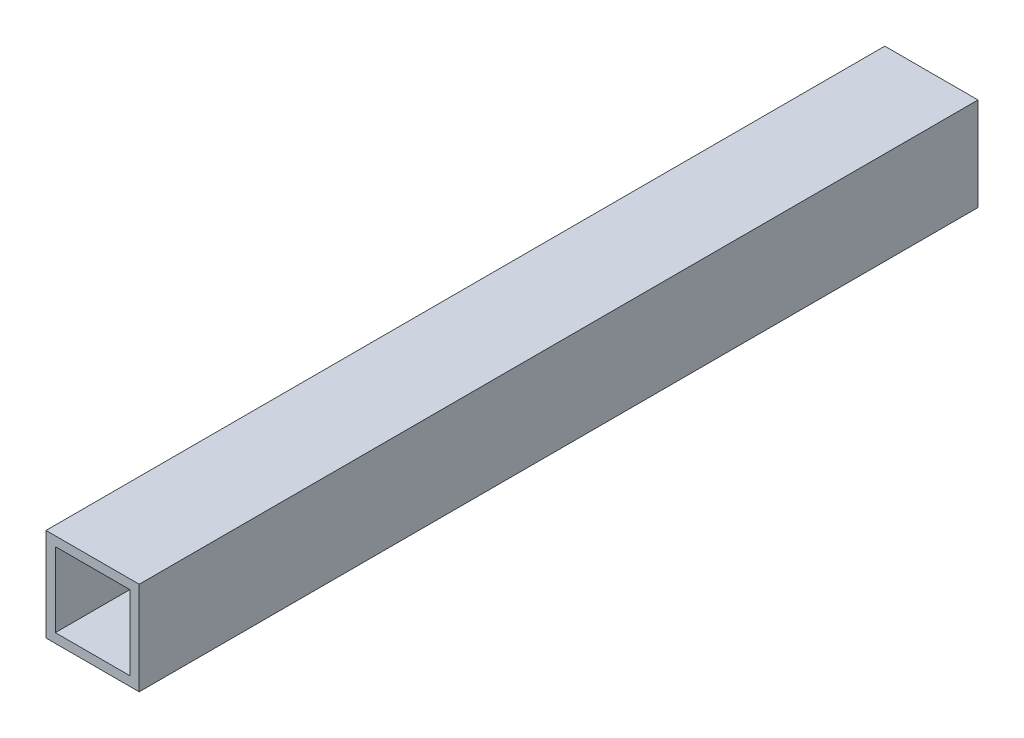
ISO-10303-21;
HEADER;
FILE_DESCRIPTION(('STEP AP214'),'2;1');
FILE_NAME('part.step','',(''),(''),'','','');
FILE_SCHEMA(('AUTOMOTIVE_DESIGN { 1 0 10303 214 1 1 1 1 }'));
ENDSEC;
DATA;
#1=APPLICATION_CONTEXT('core data for automotive mechanical design processes');
#2=APPLICATION_PROTOCOL_DEFINITION('international standard','automotive_design',2000,#1);
#3=PRODUCT_CONTEXT('',#1,'mechanical');
#4=PRODUCT('Part','Part','',(#3));
#5=PRODUCT_RELATED_PRODUCT_CATEGORY('part','',(#4));
#6=PRODUCT_DEFINITION_FORMATION('','',#4);
#7=PRODUCT_DEFINITION_CONTEXT('part definition',#1,'design');
#8=PRODUCT_DEFINITION('design','',#6,#7);
#9=PRODUCT_DEFINITION_SHAPE('','',#8);
#10=(LENGTH_UNIT() NAMED_UNIT(*) SI_UNIT(.MILLI.,.METRE.));
#11=(NAMED_UNIT(*) PLANE_ANGLE_UNIT() SI_UNIT($,.RADIAN.));
#12=(NAMED_UNIT(*) SI_UNIT($,.STERADIAN.) SOLID_ANGLE_UNIT());
#13=UNCERTAINTY_MEASURE_WITH_UNIT(LENGTH_MEASURE(1.E-05),#10,'distance_accuracy_value','');
#14=(GEOMETRIC_REPRESENTATION_CONTEXT(3) GLOBAL_UNCERTAINTY_ASSIGNED_CONTEXT((#13)) GLOBAL_UNIT_ASSIGNED_CONTEXT((#10,
#11,#12)) REPRESENTATION_CONTEXT('',''));
#15=CARTESIAN_POINT('',(0.,0.,0.));
#16=DIRECTION('',(0.,0.,1.));
#17=DIRECTION('',(1.,0.,0.));
#18=AXIS2_PLACEMENT_3D('',#15,#16,#17);
#19=CARTESIAN_POINT('',(0.,0.,114.3));
#20=DIRECTION('',(0.,0.,-1.));
#21=DIRECTION('',(-1.,0.,0.));
#22=AXIS2_PLACEMENT_3D('',#19,#20,#21);
#23=PLANE('',#22);
#24=DIRECTION('',(0.,1.,0.));
#25=VECTOR('',#24,1.);
#26=CARTESIAN_POINT('',(12.7,-12.7,114.3));
#27=LINE('',#26,#25);
#28=CARTESIAN_POINT('',(12.7,-12.7,114.3));
#29=VERTEX_POINT('',#28);
#30=CARTESIAN_POINT('',(12.7,12.7,114.3));
#31=VERTEX_POINT('',#30);
#32=EDGE_CURVE('E135',#29,#31,#27,.T.);
#33=ORIENTED_EDGE('',*,*,#32,.T.);
#34=DIRECTION('',(-1.,0.,0.));
#35=VECTOR('',#34,1.);
#36=CARTESIAN_POINT('',(-12.7,12.7,114.3));
#37=LINE('',#36,#35);
#38=CARTESIAN_POINT('',(-12.7,12.7,114.3));
#39=VERTEX_POINT('',#38);
#40=EDGE_CURVE('E138',#31,#39,#37,.T.);
#41=ORIENTED_EDGE('',*,*,#40,.T.);
#42=DIRECTION('',(0.,-1.,0.));
#43=VECTOR('',#42,1.);
#44=CARTESIAN_POINT('',(-12.7,-12.7,114.3));
#45=LINE('',#44,#43);
#46=CARTESIAN_POINT('',(-12.7,-12.7,114.3));
#47=VERTEX_POINT('',#46);
#48=EDGE_CURVE('E141',#39,#47,#45,.T.);
#49=ORIENTED_EDGE('',*,*,#48,.T.);
#50=DIRECTION('',(1.,0.,0.));
#51=VECTOR('',#50,1.);
#52=CARTESIAN_POINT('',(-12.7,-12.7,114.3));
#53=LINE('',#52,#51);
#54=EDGE_CURVE('E143',#47,#29,#53,.T.);
#55=ORIENTED_EDGE('',*,*,#54,.T.);
#56=EDGE_LOOP('',(#33,#41,#49,#55));
#57=FACE_BOUND('',#56,.T.);
#58=DIRECTION('',(0.,-1.,0.));
#59=VECTOR('',#58,1.);
#60=CARTESIAN_POINT('',(-10.16,-10.16,114.3));
#61=LINE('',#60,#59);
#62=CARTESIAN_POINT('',(-10.16,10.16,114.3));
#63=VERTEX_POINT('',#62);
#64=CARTESIAN_POINT('',(-10.16,-10.16,114.3));
#65=VERTEX_POINT('',#64);
#66=EDGE_CURVE('E99',#63,#65,#61,.T.);
#67=ORIENTED_EDGE('',*,*,#66,.F.);
#68=DIRECTION('',(-1.,0.,0.));
#69=VECTOR('',#68,1.);
#70=CARTESIAN_POINT('',(-10.16,10.16,114.3));
#71=LINE('',#70,#69);
#72=CARTESIAN_POINT('',(10.16,10.16,114.3));
#73=VERTEX_POINT('',#72);
#74=EDGE_CURVE('E121',#73,#63,#71,.T.);
#75=ORIENTED_EDGE('',*,*,#74,.F.);
#76=DIRECTION('',(0.,1.,0.));
#77=VECTOR('',#76,1.);
#78=CARTESIAN_POINT('',(10.16,-10.16,114.3));
#79=LINE('',#78,#77);
#80=CARTESIAN_POINT('',(10.16,-10.16,114.3));
#81=VERTEX_POINT('',#80);
#82=EDGE_CURVE('E119',#81,#73,#79,.T.);
#83=ORIENTED_EDGE('',*,*,#82,.F.);
#84=DIRECTION('',(1.,0.,0.));
#85=VECTOR('',#84,1.);
#86=CARTESIAN_POINT('',(-10.16,-10.16,114.3));
#87=LINE('',#86,#85);
#88=EDGE_CURVE('E107',#65,#81,#87,.T.);
#89=ORIENTED_EDGE('',*,*,#88,.F.);
#90=EDGE_LOOP('',(#67,#75,#83,#89));
#91=FACE_BOUND('',#90,.T.);
#92=ADVANCED_FACE('F34',(#57,#91),#23,.F.);
#93=CARTESIAN_POINT('',(0.,0.,-114.3));
#94=DIRECTION('',(0.,0.,-1.));
#95=DIRECTION('',(-1.,0.,0.));
#96=AXIS2_PLACEMENT_3D('',#93,#94,#95);
#97=PLANE('',#96);
#98=DIRECTION('',(0.,1.,0.));
#99=VECTOR('',#98,1.);
#100=CARTESIAN_POINT('',(12.7,-12.7,-114.3));
#101=LINE('',#100,#99);
#102=CARTESIAN_POINT('',(12.7,-12.7,-114.3));
#103=VERTEX_POINT('',#102);
#104=CARTESIAN_POINT('',(12.7,12.7,-114.3));
#105=VERTEX_POINT('',#104);
#106=EDGE_CURVE('E115',#103,#105,#101,.T.);
#107=ORIENTED_EDGE('',*,*,#106,.F.);
#108=DIRECTION('',(1.,0.,0.));
#109=VECTOR('',#108,1.);
#110=CARTESIAN_POINT('',(-12.7,-12.7,-114.3));
#111=LINE('',#110,#109);
#112=CARTESIAN_POINT('',(-12.7,-12.7,-114.3));
#113=VERTEX_POINT('',#112);
#114=EDGE_CURVE('E139',#113,#103,#111,.T.);
#115=ORIENTED_EDGE('',*,*,#114,.F.);
#116=DIRECTION('',(0.,-1.,0.));
#117=VECTOR('',#116,1.);
#118=CARTESIAN_POINT('',(-12.7,-12.7,-114.3));
#119=LINE('',#118,#117);
#120=CARTESIAN_POINT('',(-12.7,12.7,-114.3));
#121=VERTEX_POINT('',#120);
#122=EDGE_CURVE('E150',#121,#113,#119,.T.);
#123=ORIENTED_EDGE('',*,*,#122,.F.);
#124=DIRECTION('',(-1.,0.,0.));
#125=VECTOR('',#124,1.);
#126=CARTESIAN_POINT('',(-12.7,12.7,-114.3));
#127=LINE('',#126,#125);
#128=EDGE_CURVE('E148',#105,#121,#127,.T.);
#129=ORIENTED_EDGE('',*,*,#128,.F.);
#130=EDGE_LOOP('',(#107,#115,#123,#129));
#131=FACE_BOUND('',#130,.T.);
#132=DIRECTION('',(-1.,0.,0.));
#133=VECTOR('',#132,1.);
#134=CARTESIAN_POINT('',(-10.16,10.16,-114.3));
#135=LINE('',#134,#133);
#136=CARTESIAN_POINT('',(10.16,10.16,-114.3));
#137=VERTEX_POINT('',#136);
#138=CARTESIAN_POINT('',(-10.16,10.16,-114.3));
#139=VERTEX_POINT('',#138);
#140=EDGE_CURVE('E108',#137,#139,#135,.T.);
#141=ORIENTED_EDGE('',*,*,#140,.T.);
#142=DIRECTION('',(0.,-1.,0.));
#143=VECTOR('',#142,1.);
#144=CARTESIAN_POINT('',(-10.16,-10.16,-114.3));
#145=LINE('',#144,#143);
#146=CARTESIAN_POINT('',(-10.16,-10.16,-114.3));
#147=VERTEX_POINT('',#146);
#148=EDGE_CURVE('E57',#139,#147,#145,.T.);
#149=ORIENTED_EDGE('',*,*,#148,.T.);
#150=DIRECTION('',(1.,0.,0.));
#151=VECTOR('',#150,1.);
#152=CARTESIAN_POINT('',(-10.16,-10.16,-114.3));
#153=LINE('',#152,#151);
#154=CARTESIAN_POINT('',(10.16,-10.16,-114.3));
#155=VERTEX_POINT('',#154);
#156=EDGE_CURVE('E114',#147,#155,#153,.T.);
#157=ORIENTED_EDGE('',*,*,#156,.T.);
#158=DIRECTION('',(0.,1.,0.));
#159=VECTOR('',#158,1.);
#160=CARTESIAN_POINT('',(10.16,-10.16,-114.3));
#161=LINE('',#160,#159);
#162=EDGE_CURVE('E127',#155,#137,#161,.T.);
#163=ORIENTED_EDGE('',*,*,#162,.T.);
#164=EDGE_LOOP('',(#141,#149,#157,#163));
#165=FACE_BOUND('',#164,.T.);
#166=ADVANCED_FACE('F168',(#131,#165),#97,.T.);
#167=CARTESIAN_POINT('',(12.7,-12.7,114.3));
#168=DIRECTION('',(-1.,0.,0.));
#169=DIRECTION('',(0.,-1.,0.));
#170=AXIS2_PLACEMENT_3D('',#167,#168,#169);
#171=PLANE('',#170);
#172=ORIENTED_EDGE('',*,*,#106,.T.);
#173=DIRECTION('',(0.,0.,-1.));
#174=VECTOR('',#173,1.);
#175=CARTESIAN_POINT('',(12.7,12.7,114.3));
#176=LINE('',#175,#174);
#177=EDGE_CURVE('E11',#31,#105,#176,.T.);
#178=ORIENTED_EDGE('',*,*,#177,.F.);
#179=ORIENTED_EDGE('',*,*,#32,.F.);
#180=DIRECTION('',(0.,0.,-1.));
#181=VECTOR('',#180,1.);
#182=CARTESIAN_POINT('',(12.7,-12.7,114.3));
#183=LINE('',#182,#181);
#184=EDGE_CURVE('E145',#29,#103,#183,.T.);
#185=ORIENTED_EDGE('',*,*,#184,.T.);
#186=EDGE_LOOP('',(#172,#178,#179,#185));
#187=FACE_BOUND('',#186,.T.);
#188=ADVANCED_FACE('F36',(#187),#171,.F.);
#189=CARTESIAN_POINT('',(-12.7,12.7,114.3));
#190=DIRECTION('',(0.,-1.,0.));
#191=DIRECTION('',(0.,0.,-1.));
#192=AXIS2_PLACEMENT_3D('',#189,#190,#191);
#193=PLANE('',#192);
#194=ORIENTED_EDGE('',*,*,#128,.T.);
#195=DIRECTION('',(0.,0.,-1.));
#196=VECTOR('',#195,1.);
#197=CARTESIAN_POINT('',(-12.7,12.7,114.3));
#198=LINE('',#197,#196);
#199=EDGE_CURVE('E42',#39,#121,#198,.T.);
#200=ORIENTED_EDGE('',*,*,#199,.F.);
#201=ORIENTED_EDGE('',*,*,#40,.F.);
#202=ORIENTED_EDGE('',*,*,#177,.T.);
#203=EDGE_LOOP('',(#194,#200,#201,#202));
#204=FACE_BOUND('',#203,.T.);
#205=ADVANCED_FACE('F178',(#204),#193,.F.);
#206=CARTESIAN_POINT('',(-12.7,-12.7,114.3));
#207=DIRECTION('',(1.,0.,0.));
#208=DIRECTION('',(0.,1.,0.));
#209=AXIS2_PLACEMENT_3D('',#206,#207,#208);
#210=PLANE('',#209);
#211=ORIENTED_EDGE('',*,*,#122,.T.);
#212=DIRECTION('',(0.,0.,-1.));
#213=VECTOR('',#212,1.);
#214=CARTESIAN_POINT('',(-12.7,-12.7,114.3));
#215=LINE('',#214,#213);
#216=EDGE_CURVE('E155',#47,#113,#215,.T.);
#217=ORIENTED_EDGE('',*,*,#216,.F.);
#218=ORIENTED_EDGE('',*,*,#48,.F.);
#219=ORIENTED_EDGE('',*,*,#199,.T.);
#220=EDGE_LOOP('',(#211,#217,#218,#219));
#221=FACE_BOUND('',#220,.T.);
#222=ADVANCED_FACE('F162',(#221),#210,.F.);
#223=CARTESIAN_POINT('',(-12.7,-12.7,114.3));
#224=DIRECTION('',(0.,1.,0.));
#225=DIRECTION('',(-1.,0.,0.));
#226=AXIS2_PLACEMENT_3D('',#223,#224,#225);
#227=PLANE('',#226);
#228=ORIENTED_EDGE('',*,*,#114,.T.);
#229=ORIENTED_EDGE('',*,*,#184,.F.);
#230=ORIENTED_EDGE('',*,*,#54,.F.);
#231=ORIENTED_EDGE('',*,*,#216,.T.);
#232=EDGE_LOOP('',(#228,#229,#230,#231));
#233=FACE_BOUND('',#232,.T.);
#234=ADVANCED_FACE('F172',(#233),#227,.F.);
#235=CARTESIAN_POINT('',(-10.16,-10.16,114.3));
#236=DIRECTION('',(1.,0.,0.));
#237=DIRECTION('',(0.,0.,-1.));
#238=AXIS2_PLACEMENT_3D('',#235,#236,#237);
#239=PLANE('',#238);
#240=ORIENTED_EDGE('',*,*,#148,.F.);
#241=DIRECTION('',(0.,0.,-1.));
#242=VECTOR('',#241,1.);
#243=CARTESIAN_POINT('',(-10.16,10.16,114.3));
#244=LINE('',#243,#242);
#245=EDGE_CURVE('E103',#63,#139,#244,.T.);
#246=ORIENTED_EDGE('',*,*,#245,.F.);
#247=ORIENTED_EDGE('',*,*,#66,.T.);
#248=DIRECTION('',(0.,0.,-1.));
#249=VECTOR('',#248,1.);
#250=CARTESIAN_POINT('',(-10.16,-10.16,114.3));
#251=LINE('',#250,#249);
#252=EDGE_CURVE('E102',#65,#147,#251,.T.);
#253=ORIENTED_EDGE('',*,*,#252,.T.);
#254=EDGE_LOOP('',(#240,#246,#247,#253));
#255=FACE_BOUND('',#254,.T.);
#256=ADVANCED_FACE('F101',(#255),#239,.T.);
#257=CARTESIAN_POINT('',(-10.16,-10.16,114.3));
#258=DIRECTION('',(0.,1.,0.));
#259=DIRECTION('',(0.,0.,1.));
#260=AXIS2_PLACEMENT_3D('',#257,#258,#259);
#261=PLANE('',#260);
#262=ORIENTED_EDGE('',*,*,#156,.F.);
#263=ORIENTED_EDGE('',*,*,#252,.F.);
#264=ORIENTED_EDGE('',*,*,#88,.T.);
#265=DIRECTION('',(0.,0.,-1.));
#266=VECTOR('',#265,1.);
#267=CARTESIAN_POINT('',(10.16,-10.16,114.3));
#268=LINE('',#267,#266);
#269=EDGE_CURVE('E116',#81,#155,#268,.T.);
#270=ORIENTED_EDGE('',*,*,#269,.T.);
#271=EDGE_LOOP('',(#262,#263,#264,#270));
#272=FACE_BOUND('',#271,.T.);
#273=ADVANCED_FACE('F111',(#272),#261,.T.);
#274=CARTESIAN_POINT('',(10.16,-10.16,114.3));
#275=DIRECTION('',(-1.,0.,0.));
#276=DIRECTION('',(0.,0.,1.));
#277=AXIS2_PLACEMENT_3D('',#274,#275,#276);
#278=PLANE('',#277);
#279=ORIENTED_EDGE('',*,*,#162,.F.);
#280=ORIENTED_EDGE('',*,*,#269,.F.);
#281=ORIENTED_EDGE('',*,*,#82,.T.);
#282=DIRECTION('',(0.,0.,-1.));
#283=VECTOR('',#282,1.);
#284=CARTESIAN_POINT('',(10.16,10.16,114.3));
#285=LINE('',#284,#283);
#286=EDGE_CURVE('E49',#73,#137,#285,.T.);
#287=ORIENTED_EDGE('',*,*,#286,.T.);
#288=EDGE_LOOP('',(#279,#280,#281,#287));
#289=FACE_BOUND('',#288,.T.);
#290=ADVANCED_FACE('F201',(#289),#278,.T.);
#291=CARTESIAN_POINT('',(-10.16,10.16,114.3));
#292=DIRECTION('',(0.,-1.,0.));
#293=DIRECTION('',(0.,0.,-1.));
#294=AXIS2_PLACEMENT_3D('',#291,#292,#293);
#295=PLANE('',#294);
#296=ORIENTED_EDGE('',*,*,#140,.F.);
#297=ORIENTED_EDGE('',*,*,#286,.F.);
#298=ORIENTED_EDGE('',*,*,#74,.T.);
#299=ORIENTED_EDGE('',*,*,#245,.T.);
#300=EDGE_LOOP('',(#296,#297,#298,#299));
#301=FACE_BOUND('',#300,.T.);
#302=ADVANCED_FACE('F205',(#301),#295,.T.);
#303=CLOSED_SHELL('',(#92,#166,#188,#205,#222,#234,#256,#273,#290,#302));
#304=MANIFOLD_SOLID_BREP('B2',#303);
#305=ADVANCED_BREP_SHAPE_REPRESENTATION('',(#18,#304),#14);
#306=SHAPE_DEFINITION_REPRESENTATION(#9,#305);
ENDSEC;
END-ISO-10303-21;
